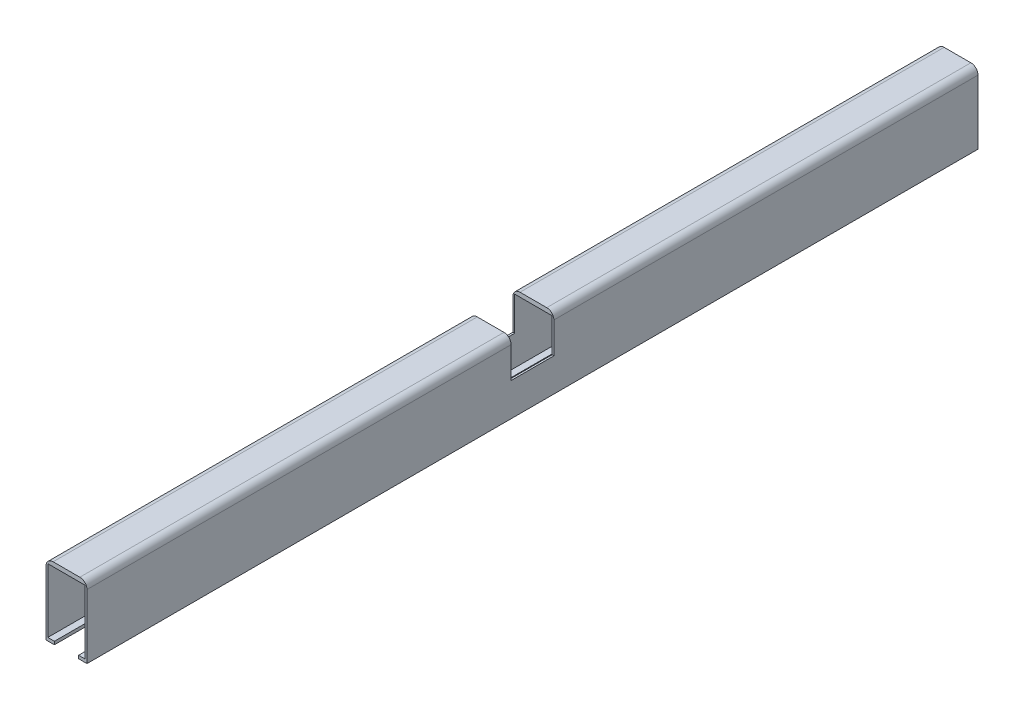
ISO-10303-21;
HEADER;
FILE_DESCRIPTION(('STEP AP214'),'2;1');
FILE_NAME('part.step','',(''),(''),'','','');
FILE_SCHEMA(('AUTOMOTIVE_DESIGN { 1 0 10303 214 1 1 1 1 }'));
ENDSEC;
DATA;
#1=APPLICATION_CONTEXT('core data for automotive mechanical design processes');
#2=APPLICATION_PROTOCOL_DEFINITION('international standard','automotive_design',2000,#1);
#3=PRODUCT_CONTEXT('',#1,'mechanical');
#4=PRODUCT('Part','Part','',(#3));
#5=PRODUCT_RELATED_PRODUCT_CATEGORY('part','',(#4));
#6=PRODUCT_DEFINITION_FORMATION('','',#4);
#7=PRODUCT_DEFINITION_CONTEXT('part definition',#1,'design');
#8=PRODUCT_DEFINITION('design','',#6,#7);
#9=PRODUCT_DEFINITION_SHAPE('','',#8);
#10=(LENGTH_UNIT() NAMED_UNIT(*) SI_UNIT(.MILLI.,.METRE.));
#11=(NAMED_UNIT(*) PLANE_ANGLE_UNIT() SI_UNIT($,.RADIAN.));
#12=(NAMED_UNIT(*) SI_UNIT($,.STERADIAN.) SOLID_ANGLE_UNIT());
#13=UNCERTAINTY_MEASURE_WITH_UNIT(LENGTH_MEASURE(1.E-05),#10,'distance_accuracy_value','');
#14=(GEOMETRIC_REPRESENTATION_CONTEXT(3) GLOBAL_UNCERTAINTY_ASSIGNED_CONTEXT((#13)) GLOBAL_UNIT_ASSIGNED_CONTEXT((#10,
#11,#12)) REPRESENTATION_CONTEXT('',''));
#15=CARTESIAN_POINT('',(0.,0.,0.));
#16=DIRECTION('',(0.,0.,1.));
#17=DIRECTION('',(1.,0.,0.));
#18=AXIS2_PLACEMENT_3D('',#15,#16,#17);
#19=CARTESIAN_POINT('',(11.5,0.,250.));
#20=DIRECTION('',(-1.,0.,0.));
#21=DIRECTION('',(0.,0.,1.));
#22=AXIS2_PLACEMENT_3D('',#19,#20,#21);
#23=PLANE('',#22);
#24=DIRECTION('',(0.,1.,0.));
#25=VECTOR('',#24,1.);
#26=CARTESIAN_POINT('',(11.5,40.,12.));
#27=LINE('',#26,#25);
#28=CARTESIAN_POINT('',(11.5,18.58,12.));
#29=VERTEX_POINT('',#28);
#30=CARTESIAN_POINT('',(11.5,36.,12.));
#31=VERTEX_POINT('',#30);
#32=EDGE_CURVE('E245',#29,#31,#27,.T.);
#33=ORIENTED_EDGE('',*,*,#32,.T.);
#34=DIRECTION('',(0.,0.,-1.));
#35=VECTOR('',#34,1.);
#36=CARTESIAN_POINT('',(11.5,36.,250.));
#37=LINE('',#36,#35);
#38=CARTESIAN_POINT('',(11.5,36.,250.));
#39=VERTEX_POINT('',#38);
#40=EDGE_CURVE('E40',#39,#31,#37,.T.);
#41=ORIENTED_EDGE('',*,*,#40,.F.);
#42=DIRECTION('',(0.,1.,0.));
#43=VECTOR('',#42,1.);
#44=CARTESIAN_POINT('',(11.5,0.,250.));
#45=LINE('',#44,#43);
#46=CARTESIAN_POINT('',(11.5,0.,250.));
#47=VERTEX_POINT('',#46);
#48=EDGE_CURVE('E267',#47,#39,#45,.T.);
#49=ORIENTED_EDGE('',*,*,#48,.F.);
#50=DIRECTION('',(0.,0.,-1.));
#51=VECTOR('',#50,1.);
#52=CARTESIAN_POINT('',(11.5,0.,250.));
#53=LINE('',#52,#51);
#54=CARTESIAN_POINT('',(11.5,0.,-250.));
#55=VERTEX_POINT('',#54);
#56=EDGE_CURVE('E11',#47,#55,#53,.T.);
#57=ORIENTED_EDGE('',*,*,#56,.T.);
#58=DIRECTION('',(0.,1.,0.));
#59=VECTOR('',#58,1.);
#60=CARTESIAN_POINT('',(11.5,0.,-250.));
#61=LINE('',#60,#59);
#62=CARTESIAN_POINT('',(11.5,36.,-250.));
#63=VERTEX_POINT('',#62);
#64=EDGE_CURVE('E297',#55,#63,#61,.T.);
#65=ORIENTED_EDGE('',*,*,#64,.T.);
#66=CARTESIAN_POINT('',(11.5,36.,-12.));
#67=VERTEX_POINT('',#66);
#68=EDGE_CURVE('E365',#67,#63,#37,.T.);
#69=ORIENTED_EDGE('',*,*,#68,.F.);
#70=DIRECTION('',(0.,-1.,0.));
#71=VECTOR('',#70,1.);
#72=CARTESIAN_POINT('',(11.5,40.,-12.));
#73=LINE('',#72,#71);
#74=CARTESIAN_POINT('',(11.5,18.58,-12.));
#75=VERTEX_POINT('',#74);
#76=EDGE_CURVE('E260',#67,#75,#73,.T.);
#77=ORIENTED_EDGE('',*,*,#76,.T.);
#78=DIRECTION('',(0.,0.,1.));
#79=VECTOR('',#78,1.);
#80=CARTESIAN_POINT('',(11.5,18.58,12.));
#81=LINE('',#80,#79);
#82=EDGE_CURVE('E242',#75,#29,#81,.T.);
#83=ORIENTED_EDGE('',*,*,#82,.T.);
#84=EDGE_LOOP('',(#33,#41,#49,#57,#65,#69,#77,#83));
#85=FACE_BOUND('',#84,.T.);
#86=ADVANCED_FACE('F32',(#85),#23,.F.);
#87=CARTESIAN_POINT('',(7.5,36.,250.));
#88=DIRECTION('',(0.,0.,-1.));
#89=DIRECTION('',(-1.,0.,0.));
#90=AXIS2_PLACEMENT_3D('',#87,#88,#89);
#91=CYLINDRICAL_SURFACE('',#90,4.);
#92=CARTESIAN_POINT('',(7.5,36.,12.));
#93=DIRECTION('',(0.,0.,-1.));
#94=DIRECTION('',(0.,1.,0.));
#95=AXIS2_PLACEMENT_3D('',#92,#93,#94);
#96=CIRCLE('',#95,4.);
#97=CARTESIAN_POINT('',(7.49999999999997,40.,12.));
#98=VERTEX_POINT('',#97);
#99=EDGE_CURVE('E233',#31,#98,#96,.F.);
#100=ORIENTED_EDGE('',*,*,#99,.T.);
#101=DIRECTION('',(0.,0.,-1.));
#102=VECTOR('',#101,1.);
#103=CARTESIAN_POINT('',(7.49999999999997,40.,250.));
#104=LINE('',#103,#102);
#105=CARTESIAN_POINT('',(7.49999999999997,40.,250.));
#106=VERTEX_POINT('',#105);
#107=EDGE_CURVE('E363',#106,#98,#104,.T.);
#108=ORIENTED_EDGE('',*,*,#107,.F.);
#109=CARTESIAN_POINT('',(7.5,36.,250.));
#110=DIRECTION('',(0.,0.,1.));
#111=DIRECTION('',(1.,0.,0.));
#112=AXIS2_PLACEMENT_3D('',#109,#110,#111);
#113=CIRCLE('',#112,4.);
#114=EDGE_CURVE('E270',#39,#106,#113,.T.);
#115=ORIENTED_EDGE('',*,*,#114,.F.);
#116=ORIENTED_EDGE('',*,*,#40,.T.);
#117=EDGE_LOOP('',(#100,#108,#115,#116));
#118=FACE_BOUND('',#117,.T.);
#119=ADVANCED_FACE('F421',(#118),#91,.T.);
#120=CARTESIAN_POINT('',(7.5,36.,-12.));
#121=DIRECTION('',(0.,0.,1.));
#122=DIRECTION('',(0.,-1.,0.));
#123=AXIS2_PLACEMENT_3D('',#120,#121,#122);
#124=CIRCLE('',#123,4.);
#125=CARTESIAN_POINT('',(7.5,40.,-12.));
#126=VERTEX_POINT('',#125);
#127=EDGE_CURVE('E230',#126,#67,#124,.F.);
#128=ORIENTED_EDGE('',*,*,#127,.T.);
#129=ORIENTED_EDGE('',*,*,#68,.T.);
#130=CARTESIAN_POINT('',(7.5,36.,-250.));
#131=DIRECTION('',(0.,0.,1.));
#132=DIRECTION('',(1.,0.,0.));
#133=AXIS2_PLACEMENT_3D('',#130,#131,#132);
#134=CIRCLE('',#133,4.);
#135=CARTESIAN_POINT('',(7.49999999999997,40.,-250.));
#136=VERTEX_POINT('',#135);
#137=EDGE_CURVE('E300',#63,#136,#134,.T.);
#138=ORIENTED_EDGE('',*,*,#137,.T.);
#139=EDGE_CURVE('E362',#126,#136,#104,.T.);
#140=ORIENTED_EDGE('',*,*,#139,.F.);
#141=EDGE_LOOP('',(#128,#129,#138,#140));
#142=FACE_BOUND('',#141,.T.);
#143=ADVANCED_FACE('F372',(#142),#91,.T.);
#144=CARTESIAN_POINT('',(7.49999999999997,40.,250.));
#145=DIRECTION('',(0.,-1.,0.));
#146=DIRECTION('',(0.,0.,-1.));
#147=AXIS2_PLACEMENT_3D('',#144,#145,#146);
#148=PLANE('',#147);
#149=DIRECTION('',(-1.,0.,0.));
#150=VECTOR('',#149,1.);
#151=CARTESIAN_POINT('',(11.501,40.,12.));
#152=LINE('',#151,#150);
#153=CARTESIAN_POINT('',(-7.5,40.,12.));
#154=VERTEX_POINT('',#153);
#155=EDGE_CURVE('E248',#98,#154,#152,.T.);
#156=ORIENTED_EDGE('',*,*,#155,.T.);
#157=DIRECTION('',(0.,0.,-1.));
#158=VECTOR('',#157,1.);
#159=CARTESIAN_POINT('',(-7.49999999999997,40.,250.));
#160=LINE('',#159,#158);
#161=CARTESIAN_POINT('',(-7.49999999999997,40.,250.));
#162=VERTEX_POINT('',#161);
#163=EDGE_CURVE('E359',#162,#154,#160,.T.);
#164=ORIENTED_EDGE('',*,*,#163,.F.);
#165=DIRECTION('',(-1.,0.,0.));
#166=VECTOR('',#165,1.);
#167=CARTESIAN_POINT('',(7.49999999999997,40.,250.));
#168=LINE('',#167,#166);
#169=EDGE_CURVE('E272',#106,#162,#168,.T.);
#170=ORIENTED_EDGE('',*,*,#169,.F.);
#171=ORIENTED_EDGE('',*,*,#107,.T.);
#172=EDGE_LOOP('',(#156,#164,#170,#171));
#173=FACE_BOUND('',#172,.T.);
#174=ADVANCED_FACE('F419',(#173),#148,.F.);
#175=DIRECTION('',(-1.,0.,0.));
#176=VECTOR('',#175,1.);
#177=CARTESIAN_POINT('',(11.501,40.,-12.));
#178=LINE('',#177,#176);
#179=CARTESIAN_POINT('',(-7.5,40.,-12.));
#180=VERTEX_POINT('',#179);
#181=EDGE_CURVE('E251',#126,#180,#178,.T.);
#182=ORIENTED_EDGE('',*,*,#181,.F.);
#183=ORIENTED_EDGE('',*,*,#139,.T.);
#184=DIRECTION('',(-1.,0.,0.));
#185=VECTOR('',#184,1.);
#186=CARTESIAN_POINT('',(7.49999999999997,40.,-250.));
#187=LINE('',#186,#185);
#188=CARTESIAN_POINT('',(-7.49999999999997,40.,-250.));
#189=VERTEX_POINT('',#188);
#190=EDGE_CURVE('E303',#136,#189,#187,.T.);
#191=ORIENTED_EDGE('',*,*,#190,.T.);
#192=EDGE_CURVE('E358',#180,#189,#160,.T.);
#193=ORIENTED_EDGE('',*,*,#192,.F.);
#194=EDGE_LOOP('',(#182,#183,#191,#193));
#195=FACE_BOUND('',#194,.T.);
#196=ADVANCED_FACE('F386',(#195),#148,.F.);
#197=CARTESIAN_POINT('',(-7.5,36.,250.));
#198=DIRECTION('',(0.,0.,-1.));
#199=DIRECTION('',(-1.,0.,0.));
#200=AXIS2_PLACEMENT_3D('',#197,#198,#199);
#201=CYLINDRICAL_SURFACE('',#200,4.);
#202=CARTESIAN_POINT('',(-7.5,36.,12.));
#203=DIRECTION('',(0.,0.,1.));
#204=DIRECTION('',(0.,-1.,0.));
#205=AXIS2_PLACEMENT_3D('',#202,#203,#204);
#206=CIRCLE('',#205,4.);
#207=CARTESIAN_POINT('',(-11.5,36.,12.));
#208=VERTEX_POINT('',#207);
#209=EDGE_CURVE('E204',#208,#154,#206,.F.);
#210=ORIENTED_EDGE('',*,*,#209,.F.);
#211=DIRECTION('',(0.,0.,-1.));
#212=VECTOR('',#211,1.);
#213=CARTESIAN_POINT('',(-11.5,36.,250.));
#214=LINE('',#213,#212);
#215=CARTESIAN_POINT('',(-11.5,36.,250.));
#216=VERTEX_POINT('',#215);
#217=EDGE_CURVE('E217',#216,#208,#214,.T.);
#218=ORIENTED_EDGE('',*,*,#217,.F.);
#219=CARTESIAN_POINT('',(-7.5,36.,250.));
#220=DIRECTION('',(0.,0.,1.));
#221=DIRECTION('',(-1.,0.,0.));
#222=AXIS2_PLACEMENT_3D('',#219,#220,#221);
#223=CIRCLE('',#222,4.);
#224=EDGE_CURVE('E274',#162,#216,#223,.T.);
#225=ORIENTED_EDGE('',*,*,#224,.F.);
#226=ORIENTED_EDGE('',*,*,#163,.T.);
#227=EDGE_LOOP('',(#210,#218,#225,#226));
#228=FACE_BOUND('',#227,.T.);
#229=ADVANCED_FACE('F417',(#228),#201,.T.);
#230=CARTESIAN_POINT('',(-7.5,36.,-12.));
#231=DIRECTION('',(0.,0.,-1.));
#232=DIRECTION('',(0.,1.,0.));
#233=AXIS2_PLACEMENT_3D('',#230,#231,#232);
#234=CIRCLE('',#233,4.);
#235=CARTESIAN_POINT('',(-11.5,36.,-12.));
#236=VERTEX_POINT('',#235);
#237=EDGE_CURVE('E210',#180,#236,#234,.F.);
#238=ORIENTED_EDGE('',*,*,#237,.F.);
#239=ORIENTED_EDGE('',*,*,#192,.T.);
#240=CARTESIAN_POINT('',(-7.5,36.,-250.));
#241=DIRECTION('',(0.,0.,1.));
#242=DIRECTION('',(-1.,0.,0.));
#243=AXIS2_PLACEMENT_3D('',#240,#241,#242);
#244=CIRCLE('',#243,4.);
#245=CARTESIAN_POINT('',(-11.5,36.,-250.));
#246=VERTEX_POINT('',#245);
#247=EDGE_CURVE('E306',#189,#246,#244,.T.);
#248=ORIENTED_EDGE('',*,*,#247,.T.);
#249=EDGE_CURVE('E356',#236,#246,#214,.T.);
#250=ORIENTED_EDGE('',*,*,#249,.F.);
#251=EDGE_LOOP('',(#238,#239,#248,#250));
#252=FACE_BOUND('',#251,.T.);
#253=ADVANCED_FACE('F391',(#252),#201,.T.);
#254=CARTESIAN_POINT('',(-11.5,0.,250.));
#255=DIRECTION('',(1.,0.,0.));
#256=DIRECTION('',(0.,0.,-1.));
#257=AXIS2_PLACEMENT_3D('',#254,#255,#256);
#258=PLANE('',#257);
#259=DIRECTION('',(0.,1.,0.));
#260=VECTOR('',#259,1.);
#261=CARTESIAN_POINT('',(-11.5,40.,12.));
#262=LINE('',#261,#260);
#263=CARTESIAN_POINT('',(-11.5,18.58,12.));
#264=VERTEX_POINT('',#263);
#265=EDGE_CURVE('E196',#264,#208,#262,.T.);
#266=ORIENTED_EDGE('',*,*,#265,.F.);
#267=DIRECTION('',(0.,0.,1.));
#268=VECTOR('',#267,1.);
#269=CARTESIAN_POINT('',(-11.5,18.58,12.));
#270=LINE('',#269,#268);
#271=CARTESIAN_POINT('',(-11.5,18.58,-12.));
#272=VERTEX_POINT('',#271);
#273=EDGE_CURVE('E207',#272,#264,#270,.T.);
#274=ORIENTED_EDGE('',*,*,#273,.F.);
#275=DIRECTION('',(0.,-1.,0.));
#276=VECTOR('',#275,1.);
#277=CARTESIAN_POINT('',(-11.5,40.,-12.));
#278=LINE('',#277,#276);
#279=EDGE_CURVE('E47',#236,#272,#278,.T.);
#280=ORIENTED_EDGE('',*,*,#279,.F.);
#281=ORIENTED_EDGE('',*,*,#249,.T.);
#282=DIRECTION('',(0.,-1.,0.));
#283=VECTOR('',#282,1.);
#284=CARTESIAN_POINT('',(-11.5,0.,-250.));
#285=LINE('',#284,#283);
#286=CARTESIAN_POINT('',(-11.5,0.,-250.));
#287=VERTEX_POINT('',#286);
#288=EDGE_CURVE('E309',#246,#287,#285,.T.);
#289=ORIENTED_EDGE('',*,*,#288,.T.);
#290=DIRECTION('',(0.,0.,-1.));
#291=VECTOR('',#290,1.);
#292=CARTESIAN_POINT('',(-11.5,0.,250.));
#293=LINE('',#292,#291);
#294=CARTESIAN_POINT('',(-11.5,0.,250.));
#295=VERTEX_POINT('',#294);
#296=EDGE_CURVE('E353',#295,#287,#293,.T.);
#297=ORIENTED_EDGE('',*,*,#296,.F.);
#298=DIRECTION('',(0.,-1.,0.));
#299=VECTOR('',#298,1.);
#300=CARTESIAN_POINT('',(-11.5,0.,250.));
#301=LINE('',#300,#299);
#302=EDGE_CURVE('E276',#216,#295,#301,.T.);
#303=ORIENTED_EDGE('',*,*,#302,.F.);
#304=ORIENTED_EDGE('',*,*,#217,.T.);
#305=EDGE_LOOP('',(#266,#274,#280,#281,#289,#297,#303,#304));
#306=FACE_BOUND('',#305,.T.);
#307=ADVANCED_FACE('F214',(#306),#258,.F.);
#308=CARTESIAN_POINT('',(-10.485,1.73,250.));
#309=DIRECTION('',(-1.,0.,0.));
#310=DIRECTION('',(0.,0.,1.));
#311=AXIS2_PLACEMENT_3D('',#308,#309,#310);
#312=PLANE('',#311);
#313=DIRECTION('',(0.,-1.,0.));
#314=VECTOR('',#313,1.);
#315=CARTESIAN_POINT('',(-10.485,40.,12.));
#316=LINE('',#315,#314);
#317=CARTESIAN_POINT('',(-10.485,37.58,12.));
#318=VERTEX_POINT('',#317);
#319=CARTESIAN_POINT('',(-10.485,18.58,12.));
#320=VERTEX_POINT('',#319);
#321=EDGE_CURVE('E199',#318,#320,#316,.T.);
#322=ORIENTED_EDGE('',*,*,#321,.F.);
#323=DIRECTION('',(0.,0.,-1.));
#324=VECTOR('',#323,1.);
#325=CARTESIAN_POINT('',(-10.485,37.58,250.));
#326=LINE('',#325,#324);
#327=CARTESIAN_POINT('',(-10.485,37.58,250.));
#328=VERTEX_POINT('',#327);
#329=EDGE_CURVE('E341',#328,#318,#326,.T.);
#330=ORIENTED_EDGE('',*,*,#329,.F.);
#331=DIRECTION('',(0.,1.,0.));
#332=VECTOR('',#331,1.);
#333=CARTESIAN_POINT('',(-10.485,1.73,250.));
#334=LINE('',#333,#332);
#335=CARTESIAN_POINT('',(-10.485,1.73,250.));
#336=VERTEX_POINT('',#335);
#337=EDGE_CURVE('E284',#336,#328,#334,.T.);
#338=ORIENTED_EDGE('',*,*,#337,.F.);
#339=DIRECTION('',(0.,0.,-1.));
#340=VECTOR('',#339,1.);
#341=CARTESIAN_POINT('',(-10.485,1.73,250.));
#342=LINE('',#341,#340);
#343=CARTESIAN_POINT('',(-10.485,1.73,-250.));
#344=VERTEX_POINT('',#343);
#345=EDGE_CURVE('E344',#336,#344,#342,.T.);
#346=ORIENTED_EDGE('',*,*,#345,.T.);
#347=DIRECTION('',(0.,1.,0.));
#348=VECTOR('',#347,1.);
#349=CARTESIAN_POINT('',(-10.485,1.73,-250.));
#350=LINE('',#349,#348);
#351=CARTESIAN_POINT('',(-10.485,37.58,-250.));
#352=VERTEX_POINT('',#351);
#353=EDGE_CURVE('E317',#344,#352,#350,.T.);
#354=ORIENTED_EDGE('',*,*,#353,.T.);
#355=CARTESIAN_POINT('',(-10.485,37.58,-12.));
#356=VERTEX_POINT('',#355);
#357=EDGE_CURVE('E340',#356,#352,#326,.T.);
#358=ORIENTED_EDGE('',*,*,#357,.F.);
#359=DIRECTION('',(0.,1.,0.));
#360=VECTOR('',#359,1.);
#361=CARTESIAN_POINT('',(-10.485,40.,-12.));
#362=LINE('',#361,#360);
#363=CARTESIAN_POINT('',(-10.485,18.58,-12.));
#364=VERTEX_POINT('',#363);
#365=EDGE_CURVE('E437',#364,#356,#362,.T.);
#366=ORIENTED_EDGE('',*,*,#365,.F.);
#367=DIRECTION('',(0.,0.,-1.));
#368=VECTOR('',#367,1.);
#369=CARTESIAN_POINT('',(-10.485,18.58,12.));
#370=LINE('',#369,#368);
#371=EDGE_CURVE('E211',#320,#364,#370,.T.);
#372=ORIENTED_EDGE('',*,*,#371,.F.);
#373=EDGE_LOOP('',(#322,#330,#338,#346,#354,#358,#366,#372));
#374=FACE_BOUND('',#373,.T.);
#375=ADVANCED_FACE('F435',(#374),#312,.F.);
#376=CARTESIAN_POINT('',(10.485,37.58,250.));
#377=DIRECTION('',(0.,1.,0.));
#378=DIRECTION('',(0.,0.,1.));
#379=AXIS2_PLACEMENT_3D('',#376,#377,#378);
#380=PLANE('',#379);
#381=DIRECTION('',(1.,0.,0.));
#382=VECTOR('',#381,1.);
#383=CARTESIAN_POINT('',(11.501,37.58,12.));
#384=LINE('',#383,#382);
#385=CARTESIAN_POINT('',(10.485,37.58,12.));
#386=VERTEX_POINT('',#385);
#387=EDGE_CURVE('E227',#318,#386,#384,.T.);
#388=ORIENTED_EDGE('',*,*,#387,.T.);
#389=DIRECTION('',(0.,0.,-1.));
#390=VECTOR('',#389,1.);
#391=CARTESIAN_POINT('',(10.485,37.58,250.));
#392=LINE('',#391,#390);
#393=CARTESIAN_POINT('',(10.485,37.58,250.));
#394=VERTEX_POINT('',#393);
#395=EDGE_CURVE('E337',#394,#386,#392,.T.);
#396=ORIENTED_EDGE('',*,*,#395,.F.);
#397=DIRECTION('',(1.,0.,0.));
#398=VECTOR('',#397,1.);
#399=CARTESIAN_POINT('',(10.485,37.58,250.));
#400=LINE('',#399,#398);
#401=EDGE_CURVE('E286',#328,#394,#400,.T.);
#402=ORIENTED_EDGE('',*,*,#401,.F.);
#403=ORIENTED_EDGE('',*,*,#329,.T.);
#404=EDGE_LOOP('',(#388,#396,#402,#403));
#405=FACE_BOUND('',#404,.T.);
#406=ADVANCED_FACE('F433',(#405),#380,.F.);
#407=DIRECTION('',(-1.,0.,0.));
#408=VECTOR('',#407,1.);
#409=CARTESIAN_POINT('',(11.501,37.58,-12.));
#410=LINE('',#409,#408);
#411=CARTESIAN_POINT('',(10.485,37.58,-12.));
#412=VERTEX_POINT('',#411);
#413=EDGE_CURVE('E54',#412,#356,#410,.T.);
#414=ORIENTED_EDGE('',*,*,#413,.T.);
#415=ORIENTED_EDGE('',*,*,#357,.T.);
#416=DIRECTION('',(1.,0.,0.));
#417=VECTOR('',#416,1.);
#418=CARTESIAN_POINT('',(10.485,37.58,-250.));
#419=LINE('',#418,#417);
#420=CARTESIAN_POINT('',(10.485,37.58,-250.));
#421=VERTEX_POINT('',#420);
#422=EDGE_CURVE('E320',#352,#421,#419,.T.);
#423=ORIENTED_EDGE('',*,*,#422,.T.);
#424=EDGE_CURVE('E336',#412,#421,#392,.T.);
#425=ORIENTED_EDGE('',*,*,#424,.F.);
#426=EDGE_LOOP('',(#414,#415,#423,#425));
#427=FACE_BOUND('',#426,.T.);
#428=ADVANCED_FACE('F442',(#427),#380,.F.);
#429=CARTESIAN_POINT('',(10.485,1.73,250.));
#430=DIRECTION('',(1.,0.,0.));
#431=DIRECTION('',(0.,0.,-1.));
#432=AXIS2_PLACEMENT_3D('',#429,#430,#431);
#433=PLANE('',#432);
#434=DIRECTION('',(0.,-1.,0.));
#435=VECTOR('',#434,1.);
#436=CARTESIAN_POINT('',(10.485,40.,12.));
#437=LINE('',#436,#435);
#438=CARTESIAN_POINT('',(10.485,18.58,12.));
#439=VERTEX_POINT('',#438);
#440=EDGE_CURVE('E239',#386,#439,#437,.T.);
#441=ORIENTED_EDGE('',*,*,#440,.T.);
#442=DIRECTION('',(0.,0.,-1.));
#443=VECTOR('',#442,1.);
#444=CARTESIAN_POINT('',(10.485,18.58,12.));
#445=LINE('',#444,#443);
#446=CARTESIAN_POINT('',(10.485,18.58,-12.));
#447=VERTEX_POINT('',#446);
#448=EDGE_CURVE('E236',#439,#447,#445,.T.);
#449=ORIENTED_EDGE('',*,*,#448,.T.);
#450=DIRECTION('',(0.,1.,0.));
#451=VECTOR('',#450,1.);
#452=CARTESIAN_POINT('',(10.485,40.,-12.));
#453=LINE('',#452,#451);
#454=EDGE_CURVE('E258',#447,#412,#453,.T.);
#455=ORIENTED_EDGE('',*,*,#454,.T.);
#456=ORIENTED_EDGE('',*,*,#424,.T.);
#457=DIRECTION('',(0.,-1.,0.));
#458=VECTOR('',#457,1.);
#459=CARTESIAN_POINT('',(10.485,1.73,-250.));
#460=LINE('',#459,#458);
#461=CARTESIAN_POINT('',(10.485,1.73,-250.));
#462=VERTEX_POINT('',#461);
#463=EDGE_CURVE('E323',#421,#462,#460,.T.);
#464=ORIENTED_EDGE('',*,*,#463,.T.);
#465=DIRECTION('',(0.,0.,-1.));
#466=VECTOR('',#465,1.);
#467=CARTESIAN_POINT('',(10.485,1.73,250.));
#468=LINE('',#467,#466);
#469=CARTESIAN_POINT('',(10.485,1.73,250.));
#470=VERTEX_POINT('',#469);
#471=EDGE_CURVE('E333',#470,#462,#468,.T.);
#472=ORIENTED_EDGE('',*,*,#471,.F.);
#473=DIRECTION('',(0.,-1.,0.));
#474=VECTOR('',#473,1.);
#475=CARTESIAN_POINT('',(10.485,1.73,250.));
#476=LINE('',#475,#474);
#477=EDGE_CURVE('E288',#394,#470,#476,.T.);
#478=ORIENTED_EDGE('',*,*,#477,.F.);
#479=ORIENTED_EDGE('',*,*,#395,.T.);
#480=EDGE_LOOP('',(#441,#449,#455,#456,#464,#472,#478,#479));
#481=FACE_BOUND('',#480,.T.);
#482=ADVANCED_FACE('F427',(#481),#433,.F.);
#483=CARTESIAN_POINT('',(6.785,0.,250.));
#484=DIRECTION('',(0.,1.,0.));
#485=DIRECTION('',(0.,0.,1.));
#486=AXIS2_PLACEMENT_3D('',#483,#484,#485);
#487=PLANE('',#486);
#488=DIRECTION('',(1.,0.,0.));
#489=VECTOR('',#488,1.);
#490=CARTESIAN_POINT('',(6.785,0.,-250.));
#491=LINE('',#490,#489);
#492=CARTESIAN_POINT('',(6.785,0.,-250.));
#493=VERTEX_POINT('',#492);
#494=EDGE_CURVE('E263',#493,#55,#491,.T.);
#495=ORIENTED_EDGE('',*,*,#494,.T.);
#496=ORIENTED_EDGE('',*,*,#56,.F.);
#497=DIRECTION('',(1.,0.,0.));
#498=VECTOR('',#497,1.);
#499=CARTESIAN_POINT('',(6.785,0.,250.));
#500=LINE('',#499,#498);
#501=CARTESIAN_POINT('',(6.785,0.,250.));
#502=VERTEX_POINT('',#501);
#503=EDGE_CURVE('E264',#502,#47,#500,.T.);
#504=ORIENTED_EDGE('',*,*,#503,.F.);
#505=DIRECTION('',(0.,0.,-1.));
#506=VECTOR('',#505,1.);
#507=CARTESIAN_POINT('',(6.785,0.,250.));
#508=LINE('',#507,#506);
#509=EDGE_CURVE('E294',#502,#493,#508,.T.);
#510=ORIENTED_EDGE('',*,*,#509,.T.);
#511=EDGE_LOOP('',(#495,#496,#504,#510));
#512=FACE_BOUND('',#511,.T.);
#513=ADVANCED_FACE('F34',(#512),#487,.F.);
#514=CARTESIAN_POINT('',(-6.785,0.,250.));
#515=DIRECTION('',(0.,1.,0.));
#516=DIRECTION('',(0.,0.,1.));
#517=AXIS2_PLACEMENT_3D('',#514,#515,#516);
#518=PLANE('',#517);
#519=DIRECTION('',(1.,0.,0.));
#520=VECTOR('',#519,1.);
#521=CARTESIAN_POINT('',(-6.785,0.,-250.));
#522=LINE('',#521,#520);
#523=CARTESIAN_POINT('',(-6.785,0.,-250.));
#524=VERTEX_POINT('',#523);
#525=EDGE_CURVE('E311',#287,#524,#522,.T.);
#526=ORIENTED_EDGE('',*,*,#525,.T.);
#527=DIRECTION('',(0.,0.,-1.));
#528=VECTOR('',#527,1.);
#529=CARTESIAN_POINT('',(-6.785,0.,250.));
#530=LINE('',#529,#528);
#531=CARTESIAN_POINT('',(-6.785,0.,250.));
#532=VERTEX_POINT('',#531);
#533=EDGE_CURVE('E350',#532,#524,#530,.T.);
#534=ORIENTED_EDGE('',*,*,#533,.F.);
#535=DIRECTION('',(1.,0.,0.));
#536=VECTOR('',#535,1.);
#537=CARTESIAN_POINT('',(-6.785,0.,250.));
#538=LINE('',#537,#536);
#539=EDGE_CURVE('E278',#295,#532,#538,.T.);
#540=ORIENTED_EDGE('',*,*,#539,.F.);
#541=ORIENTED_EDGE('',*,*,#296,.T.);
#542=EDGE_LOOP('',(#526,#534,#540,#541));
#543=FACE_BOUND('',#542,.T.);
#544=ADVANCED_FACE('F396',(#543),#518,.F.);
#545=CARTESIAN_POINT('',(-6.785,0.,250.));
#546=DIRECTION('',(-1.,0.,0.));
#547=DIRECTION('',(0.,0.,1.));
#548=AXIS2_PLACEMENT_3D('',#545,#546,#547);
#549=PLANE('',#548);
#550=DIRECTION('',(0.,1.,0.));
#551=VECTOR('',#550,1.);
#552=CARTESIAN_POINT('',(-6.785,0.,-250.));
#553=LINE('',#552,#551);
#554=CARTESIAN_POINT('',(-6.785,1.73,-250.));
#555=VERTEX_POINT('',#554);
#556=EDGE_CURVE('E313',#524,#555,#553,.T.);
#557=ORIENTED_EDGE('',*,*,#556,.T.);
#558=DIRECTION('',(0.,0.,-1.));
#559=VECTOR('',#558,1.);
#560=CARTESIAN_POINT('',(-6.785,1.73,250.));
#561=LINE('',#560,#559);
#562=CARTESIAN_POINT('',(-6.785,1.73,250.));
#563=VERTEX_POINT('',#562);
#564=EDGE_CURVE('E347',#563,#555,#561,.T.);
#565=ORIENTED_EDGE('',*,*,#564,.F.);
#566=DIRECTION('',(0.,1.,0.));
#567=VECTOR('',#566,1.);
#568=CARTESIAN_POINT('',(-6.785,0.,250.));
#569=LINE('',#568,#567);
#570=EDGE_CURVE('E280',#532,#563,#569,.T.);
#571=ORIENTED_EDGE('',*,*,#570,.F.);
#572=ORIENTED_EDGE('',*,*,#533,.T.);
#573=EDGE_LOOP('',(#557,#565,#571,#572));
#574=FACE_BOUND('',#573,.T.);
#575=ADVANCED_FACE('F403',(#574),#549,.F.);
#576=CARTESIAN_POINT('',(-6.785,1.73,250.));
#577=DIRECTION('',(0.,-1.,0.));
#578=DIRECTION('',(1.,0.,0.));
#579=AXIS2_PLACEMENT_3D('',#576,#577,#578);
#580=PLANE('',#579);
#581=DIRECTION('',(-1.,0.,0.));
#582=VECTOR('',#581,1.);
#583=CARTESIAN_POINT('',(-6.785,1.73,-250.));
#584=LINE('',#583,#582);
#585=EDGE_CURVE('E315',#555,#344,#584,.T.);
#586=ORIENTED_EDGE('',*,*,#585,.T.);
#587=ORIENTED_EDGE('',*,*,#345,.F.);
#588=DIRECTION('',(-1.,0.,0.));
#589=VECTOR('',#588,1.);
#590=CARTESIAN_POINT('',(-6.785,1.73,250.));
#591=LINE('',#590,#589);
#592=EDGE_CURVE('E282',#563,#336,#591,.T.);
#593=ORIENTED_EDGE('',*,*,#592,.F.);
#594=ORIENTED_EDGE('',*,*,#564,.T.);
#595=EDGE_LOOP('',(#586,#587,#593,#594));
#596=FACE_BOUND('',#595,.T.);
#597=ADVANCED_FACE('F407',(#596),#580,.F.);
#598=CARTESIAN_POINT('',(6.785,1.73,250.));
#599=DIRECTION('',(0.,-1.,0.));
#600=DIRECTION('',(1.,0.,0.));
#601=AXIS2_PLACEMENT_3D('',#598,#599,#600);
#602=PLANE('',#601);
#603=DIRECTION('',(-1.,0.,0.));
#604=VECTOR('',#603,1.);
#605=CARTESIAN_POINT('',(6.785,1.73,-250.));
#606=LINE('',#605,#604);
#607=CARTESIAN_POINT('',(6.785,1.73,-250.));
#608=VERTEX_POINT('',#607);
#609=EDGE_CURVE('E325',#462,#608,#606,.T.);
#610=ORIENTED_EDGE('',*,*,#609,.T.);
#611=DIRECTION('',(0.,0.,-1.));
#612=VECTOR('',#611,1.);
#613=CARTESIAN_POINT('',(6.785,1.73,250.));
#614=LINE('',#613,#612);
#615=CARTESIAN_POINT('',(6.785,1.73,250.));
#616=VERTEX_POINT('',#615);
#617=EDGE_CURVE('E330',#616,#608,#614,.T.);
#618=ORIENTED_EDGE('',*,*,#617,.F.);
#619=DIRECTION('',(-1.,0.,0.));
#620=VECTOR('',#619,1.);
#621=CARTESIAN_POINT('',(6.785,1.73,250.));
#622=LINE('',#621,#620);
#623=EDGE_CURVE('E290',#470,#616,#622,.T.);
#624=ORIENTED_EDGE('',*,*,#623,.F.);
#625=ORIENTED_EDGE('',*,*,#471,.T.);
#626=EDGE_LOOP('',(#610,#618,#624,#625));
#627=FACE_BOUND('',#626,.T.);
#628=ADVANCED_FACE('F449',(#627),#602,.F.);
#629=CARTESIAN_POINT('',(6.785,0.,250.));
#630=DIRECTION('',(1.,0.,0.));
#631=DIRECTION('',(0.,0.,-1.));
#632=AXIS2_PLACEMENT_3D('',#629,#630,#631);
#633=PLANE('',#632);
#634=DIRECTION('',(0.,-1.,0.));
#635=VECTOR('',#634,1.);
#636=CARTESIAN_POINT('',(6.785,0.,-250.));
#637=LINE('',#636,#635);
#638=EDGE_CURVE('E268',#608,#493,#637,.T.);
#639=ORIENTED_EDGE('',*,*,#638,.T.);
#640=ORIENTED_EDGE('',*,*,#509,.F.);
#641=DIRECTION('',(0.,-1.,0.));
#642=VECTOR('',#641,1.);
#643=CARTESIAN_POINT('',(6.785,0.,250.));
#644=LINE('',#643,#642);
#645=EDGE_CURVE('E292',#616,#502,#644,.T.);
#646=ORIENTED_EDGE('',*,*,#645,.F.);
#647=ORIENTED_EDGE('',*,*,#617,.T.);
#648=EDGE_LOOP('',(#639,#640,#646,#647));
#649=FACE_BOUND('',#648,.T.);
#650=ADVANCED_FACE('F455',(#649),#633,.F.);
#651=CARTESIAN_POINT('',(7.5,36.,250.));
#652=DIRECTION('',(0.,0.,1.));
#653=DIRECTION('',(1.,0.,0.));
#654=AXIS2_PLACEMENT_3D('',#651,#652,#653);
#655=PLANE('',#654);
#656=ORIENTED_EDGE('',*,*,#503,.T.);
#657=ORIENTED_EDGE('',*,*,#48,.T.);
#658=ORIENTED_EDGE('',*,*,#114,.T.);
#659=ORIENTED_EDGE('',*,*,#169,.T.);
#660=ORIENTED_EDGE('',*,*,#224,.T.);
#661=ORIENTED_EDGE('',*,*,#302,.T.);
#662=ORIENTED_EDGE('',*,*,#539,.T.);
#663=ORIENTED_EDGE('',*,*,#570,.T.);
#664=ORIENTED_EDGE('',*,*,#592,.T.);
#665=ORIENTED_EDGE('',*,*,#337,.T.);
#666=ORIENTED_EDGE('',*,*,#401,.T.);
#667=ORIENTED_EDGE('',*,*,#477,.T.);
#668=ORIENTED_EDGE('',*,*,#623,.T.);
#669=ORIENTED_EDGE('',*,*,#645,.T.);
#670=EDGE_LOOP('',(#656,#657,#658,#659,#660,#661,#662,#663,#664,#665,#666,#667,#668,#669));
#671=FACE_BOUND('',#670,.T.);
#672=ADVANCED_FACE('F411',(#671),#655,.T.);
#673=CARTESIAN_POINT('',(7.5,36.,-250.));
#674=DIRECTION('',(0.,0.,1.));
#675=DIRECTION('',(1.,0.,0.));
#676=AXIS2_PLACEMENT_3D('',#673,#674,#675);
#677=PLANE('',#676);
#678=ORIENTED_EDGE('',*,*,#494,.F.);
#679=ORIENTED_EDGE('',*,*,#638,.F.);
#680=ORIENTED_EDGE('',*,*,#609,.F.);
#681=ORIENTED_EDGE('',*,*,#463,.F.);
#682=ORIENTED_EDGE('',*,*,#422,.F.);
#683=ORIENTED_EDGE('',*,*,#353,.F.);
#684=ORIENTED_EDGE('',*,*,#585,.F.);
#685=ORIENTED_EDGE('',*,*,#556,.F.);
#686=ORIENTED_EDGE('',*,*,#525,.F.);
#687=ORIENTED_EDGE('',*,*,#288,.F.);
#688=ORIENTED_EDGE('',*,*,#247,.F.);
#689=ORIENTED_EDGE('',*,*,#190,.F.);
#690=ORIENTED_EDGE('',*,*,#137,.F.);
#691=ORIENTED_EDGE('',*,*,#64,.F.);
#692=EDGE_LOOP('',(#678,#679,#680,#681,#682,#683,#684,#685,#686,#687,#688,#689,#690,#691));
#693=FACE_BOUND('',#692,.T.);
#694=ADVANCED_FACE('F380',(#693),#677,.F.);
#695=CARTESIAN_POINT('',(11.501,40.,12.));
#696=DIRECTION('',(0.,0.,-1.));
#697=DIRECTION('',(0.,1.,0.));
#698=AXIS2_PLACEMENT_3D('',#695,#696,#697);
#699=PLANE('',#698);
#700=DIRECTION('',(-1.,0.,0.));
#701=VECTOR('',#700,1.);
#702=CARTESIAN_POINT('',(11.501,18.58,12.));
#703=LINE('',#702,#701);
#704=EDGE_CURVE('E256',#29,#439,#703,.T.);
#705=ORIENTED_EDGE('',*,*,#704,.T.);
#706=ORIENTED_EDGE('',*,*,#440,.F.);
#707=ORIENTED_EDGE('',*,*,#387,.F.);
#708=ORIENTED_EDGE('',*,*,#321,.T.);
#709=DIRECTION('',(1.,0.,0.));
#710=VECTOR('',#709,1.);
#711=CARTESIAN_POINT('',(-11.501,18.58,12.));
#712=LINE('',#711,#710);
#713=EDGE_CURVE('E191',#264,#320,#712,.T.);
#714=ORIENTED_EDGE('',*,*,#713,.F.);
#715=ORIENTED_EDGE('',*,*,#265,.T.);
#716=ORIENTED_EDGE('',*,*,#209,.T.);
#717=ORIENTED_EDGE('',*,*,#155,.F.);
#718=ORIENTED_EDGE('',*,*,#99,.F.);
#719=ORIENTED_EDGE('',*,*,#32,.F.);
#720=EDGE_LOOP('',(#705,#706,#707,#708,#714,#715,#716,#717,#718,#719));
#721=FACE_BOUND('',#720,.T.);
#722=ADVANCED_FACE('F194',(#721),#699,.T.);
#723=CARTESIAN_POINT('',(11.501,18.58,12.));
#724=DIRECTION('',(0.,1.,0.));
#725=DIRECTION('',(0.,0.,1.));
#726=AXIS2_PLACEMENT_3D('',#723,#724,#725);
#727=PLANE('',#726);
#728=DIRECTION('',(-1.,0.,0.));
#729=VECTOR('',#728,1.);
#730=CARTESIAN_POINT('',(11.501,18.58,-12.));
#731=LINE('',#730,#729);
#732=EDGE_CURVE('E253',#75,#447,#731,.T.);
#733=ORIENTED_EDGE('',*,*,#732,.T.);
#734=ORIENTED_EDGE('',*,*,#448,.F.);
#735=ORIENTED_EDGE('',*,*,#704,.F.);
#736=ORIENTED_EDGE('',*,*,#82,.F.);
#737=EDGE_LOOP('',(#733,#734,#735,#736));
#738=FACE_BOUND('',#737,.T.);
#739=ADVANCED_FACE('F425',(#738),#727,.T.);
#740=CARTESIAN_POINT('',(11.501,40.,-12.));
#741=DIRECTION('',(0.,0.,1.));
#742=DIRECTION('',(0.,-1.,0.));
#743=AXIS2_PLACEMENT_3D('',#740,#741,#742);
#744=PLANE('',#743);
#745=ORIENTED_EDGE('',*,*,#127,.F.);
#746=ORIENTED_EDGE('',*,*,#181,.T.);
#747=ORIENTED_EDGE('',*,*,#237,.T.);
#748=ORIENTED_EDGE('',*,*,#279,.T.);
#749=DIRECTION('',(1.,0.,0.));
#750=VECTOR('',#749,1.);
#751=CARTESIAN_POINT('',(-11.501,18.58,-12.));
#752=LINE('',#751,#750);
#753=EDGE_CURVE('E203',#272,#364,#752,.T.);
#754=ORIENTED_EDGE('',*,*,#753,.T.);
#755=ORIENTED_EDGE('',*,*,#365,.T.);
#756=ORIENTED_EDGE('',*,*,#413,.F.);
#757=ORIENTED_EDGE('',*,*,#454,.F.);
#758=ORIENTED_EDGE('',*,*,#732,.F.);
#759=ORIENTED_EDGE('',*,*,#76,.F.);
#760=EDGE_LOOP('',(#745,#746,#747,#748,#754,#755,#756,#757,#758,#759));
#761=FACE_BOUND('',#760,.T.);
#762=ADVANCED_FACE('F388',(#761),#744,.T.);
#763=CARTESIAN_POINT('',(-11.501,18.58,12.));
#764=DIRECTION('',(0.,-1.,0.));
#765=DIRECTION('',(0.,0.,-1.));
#766=AXIS2_PLACEMENT_3D('',#763,#764,#765);
#767=PLANE('',#766);
#768=ORIENTED_EDGE('',*,*,#273,.T.);
#769=ORIENTED_EDGE('',*,*,#713,.T.);
#770=ORIENTED_EDGE('',*,*,#371,.T.);
#771=ORIENTED_EDGE('',*,*,#753,.F.);
#772=EDGE_LOOP('',(#768,#769,#770,#771));
#773=FACE_BOUND('',#772,.T.);
#774=ADVANCED_FACE('F208',(#773),#767,.F.);
#775=CLOSED_SHELL('',(#86,#119,#143,#174,#196,#229,#253,#307,#375,#406,#428,#482,#513,#544,#575,
#597,#628,#650,#672,#694,#722,#739,#762,#774));
#776=MANIFOLD_SOLID_BREP('B2',#775);
#777=ADVANCED_BREP_SHAPE_REPRESENTATION('',(#18,#776),#14);
#778=SHAPE_DEFINITION_REPRESENTATION(#9,#777);
ENDSEC;
END-ISO-10303-21;
